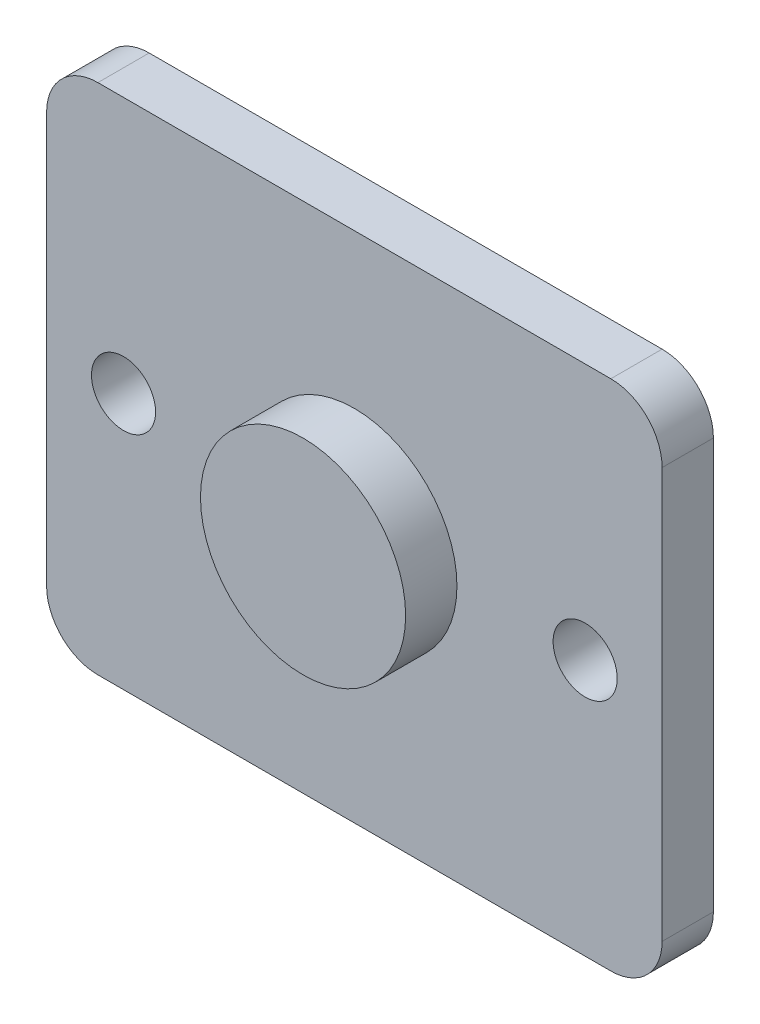
ISO-10303-21;
HEADER;
FILE_DESCRIPTION(('STEP AP214'),'2;1');
FILE_NAME('part.step','',(''),(''),'','','');
FILE_SCHEMA(('AUTOMOTIVE_DESIGN { 1 0 10303 214 1 1 1 1 }'));
ENDSEC;
DATA;
#1=APPLICATION_CONTEXT('core data for automotive mechanical design processes');
#2=APPLICATION_PROTOCOL_DEFINITION('international standard','automotive_design',2000,#1);
#3=PRODUCT_CONTEXT('',#1,'mechanical');
#4=PRODUCT('Part','Part','',(#3));
#5=PRODUCT_RELATED_PRODUCT_CATEGORY('part','',(#4));
#6=PRODUCT_DEFINITION_FORMATION('','',#4);
#7=PRODUCT_DEFINITION_CONTEXT('part definition',#1,'design');
#8=PRODUCT_DEFINITION('design','',#6,#7);
#9=PRODUCT_DEFINITION_SHAPE('','',#8);
#10=(LENGTH_UNIT() NAMED_UNIT(*) SI_UNIT(.MILLI.,.METRE.));
#11=(NAMED_UNIT(*) PLANE_ANGLE_UNIT() SI_UNIT($,.RADIAN.));
#12=(NAMED_UNIT(*) SI_UNIT($,.STERADIAN.) SOLID_ANGLE_UNIT());
#13=UNCERTAINTY_MEASURE_WITH_UNIT(LENGTH_MEASURE(1.E-05),#10,'distance_accuracy_value','');
#14=(GEOMETRIC_REPRESENTATION_CONTEXT(3) GLOBAL_UNCERTAINTY_ASSIGNED_CONTEXT((#13)) GLOBAL_UNIT_ASSIGNED_CONTEXT((#10,
#11,#12)) REPRESENTATION_CONTEXT('',''));
#15=CARTESIAN_POINT('',(0.,0.,0.));
#16=DIRECTION('',(0.,0.,1.));
#17=DIRECTION('',(1.,0.,0.));
#18=AXIS2_PLACEMENT_3D('',#15,#16,#17);
#19=CARTESIAN_POINT('',(-4.99999999994,-4.999999999969,1.));
#20=DIRECTION('',(0.,0.,-1.));
#21=DIRECTION('',(-1.,0.,0.));
#22=AXIS2_PLACEMENT_3D('',#19,#20,#21);
#23=PLANE('',#22);
#24=CARTESIAN_POINT('',(0.,0.,1.));
#25=DIRECTION('',(0.,0.,-1.));
#26=DIRECTION('',(0.,1.,0.));
#27=AXIS2_PLACEMENT_3D('',#24,#25,#26);
#28=CIRCLE('',#27,2.);
#29=CARTESIAN_POINT('',(0.,2.,1.));
#30=VERTEX_POINT('',#29);
#31=EDGE_CURVE('E140',#30,#30,#28,.F.);
#32=ORIENTED_EDGE('',*,*,#31,.F.);
#33=EDGE_LOOP('',(#32));
#34=FACE_BOUND('',#33,.T.);
#35=CARTESIAN_POINT('',(5.000000000026,4.000000000018,1.));
#36=DIRECTION('',(0.,0.,-1.));
#37=DIRECTION('',(0.,1.,0.));
#38=AXIS2_PLACEMENT_3D('',#35,#36,#37);
#39=CIRCLE('',#38,0.999999999974);
#40=CARTESIAN_POINT('',(5.000000000026,4.999999999992,1.));
#41=VERTEX_POINT('',#40);
#42=CARTESIAN_POINT('',(6.,4.000000000018,1.));
#43=VERTEX_POINT('',#42);
#44=EDGE_CURVE('E225',#41,#43,#39,.T.);
#45=ORIENTED_EDGE('',*,*,#44,.F.);
#46=DIRECTION('',(1.,0.,0.));
#47=VECTOR('',#46,1.);
#48=CARTESIAN_POINT('',(5.000000000019,4.999999999992,1.));
#49=LINE('',#48,#47);
#50=CARTESIAN_POINT('',(-4.999999999989,4.999999999992,1.));
#51=VERTEX_POINT('',#50);
#52=EDGE_CURVE('E162',#41,#51,#49,.F.);
#53=ORIENTED_EDGE('',*,*,#52,.T.);
#54=CARTESIAN_POINT('',(-4.999999999989,4.000000000018,1.));
#55=DIRECTION('',(0.,0.,-1.));
#56=DIRECTION('',(0.,1.,0.));
#57=AXIS2_PLACEMENT_3D('',#54,#55,#56);
#58=CIRCLE('',#57,0.999999999974);
#59=CARTESIAN_POINT('',(-5.9999999999815,4.0000000000215,1.));
#60=VERTEX_POINT('',#59);
#61=EDGE_CURVE('E233',#60,#51,#58,.T.);
#62=ORIENTED_EDGE('',*,*,#61,.F.);
#63=DIRECTION('',(0.,1.,0.));
#64=VECTOR('',#63,1.);
#65=CARTESIAN_POINT('',(-6.,4.00000000005,1.));
#66=LINE('',#65,#64);
#67=CARTESIAN_POINT('',(-6.,-3.999999999995,1.));
#68=VERTEX_POINT('',#67);
#69=EDGE_CURVE('E237',#60,#68,#66,.F.);
#70=ORIENTED_EDGE('',*,*,#69,.T.);
#71=CARTESIAN_POINT('',(-5.000000000026,-3.999999999995,1.));
#72=DIRECTION('',(0.,0.,-1.));
#73=DIRECTION('',(0.,1.,0.));
#74=AXIS2_PLACEMENT_3D('',#71,#72,#73);
#75=CIRCLE('',#74,0.999999999974);
#76=CARTESIAN_POINT('',(-5.0000000000045,-4.999999999969,1.));
#77=VERTEX_POINT('',#76);
#78=EDGE_CURVE('E241',#77,#68,#75,.T.);
#79=ORIENTED_EDGE('',*,*,#78,.F.);
#80=DIRECTION('',(1.,0.,0.));
#81=VECTOR('',#80,1.);
#82=CARTESIAN_POINT('',(-4.99999999994,-4.999999999969,1.));
#83=LINE('',#82,#81);
#84=CARTESIAN_POINT('',(5.000000000026,-4.999999999969,1.));
#85=VERTEX_POINT('',#84);
#86=EDGE_CURVE('E136',#77,#85,#83,.T.);
#87=ORIENTED_EDGE('',*,*,#86,.T.);
#88=CARTESIAN_POINT('',(5.000000000026,-4.000000000026,1.));
#89=DIRECTION('',(0.,0.,-1.));
#90=DIRECTION('',(0.,1.,0.));
#91=AXIS2_PLACEMENT_3D('',#88,#89,#90);
#92=CIRCLE('',#91,0.999999999974);
#93=CARTESIAN_POINT('',(6.,-4.000000000026,1.));
#94=VERTEX_POINT('',#93);
#95=EDGE_CURVE('E130',#94,#85,#92,.T.);
#96=ORIENTED_EDGE('',*,*,#95,.F.);
#97=DIRECTION('',(0.,1.,0.));
#98=VECTOR('',#97,1.);
#99=CARTESIAN_POINT('',(6.,-4.000000000026,1.));
#100=LINE('',#99,#98);
#101=EDGE_CURVE('E134',#94,#43,#100,.T.);
#102=ORIENTED_EDGE('',*,*,#101,.T.);
#103=EDGE_LOOP('',(#45,#53,#62,#70,#79,#87,#96,#102));
#104=FACE_BOUND('',#103,.T.);
#105=CARTESIAN_POINT('',(4.5,0.,1.));
#106=DIRECTION('',(0.,0.,1.));
#107=DIRECTION('',(1.,0.,0.));
#108=AXIS2_PLACEMENT_3D('',#105,#106,#107);
#109=CIRCLE('',#108,0.624999999999988);
#110=CARTESIAN_POINT('',(5.12499999999999,0.,1.));
#111=VERTEX_POINT('',#110);
#112=EDGE_CURVE('E172',#111,#111,#109,.T.);
#113=ORIENTED_EDGE('',*,*,#112,.F.);
#114=EDGE_LOOP('',(#113));
#115=FACE_BOUND('',#114,.T.);
#116=CARTESIAN_POINT('',(-4.5,0.,1.));
#117=DIRECTION('',(0.,0.,1.));
#118=DIRECTION('',(1.,0.,0.));
#119=AXIS2_PLACEMENT_3D('',#116,#117,#118);
#120=CIRCLE('',#119,0.624999999999988);
#121=CARTESIAN_POINT('',(-3.87500000000001,0.,1.));
#122=VERTEX_POINT('',#121);
#123=EDGE_CURVE('E289',#122,#122,#120,.T.);
#124=ORIENTED_EDGE('',*,*,#123,.F.);
#125=EDGE_LOOP('',(#124));
#126=FACE_BOUND('',#125,.T.);
#127=ADVANCED_FACE('F47',(#34,#104,#115,#126),#23,.F.);
#128=CARTESIAN_POINT('',(2.,0.,2.));
#129=DIRECTION('',(0.,0.,-1.));
#130=DIRECTION('',(0.,1.,0.));
#131=AXIS2_PLACEMENT_3D('',#128,#129,#130);
#132=PLANE('',#131);
#133=CARTESIAN_POINT('',(0.,0.,2.));
#134=DIRECTION('',(0.,0.,-1.));
#135=DIRECTION('',(0.,1.,0.));
#136=AXIS2_PLACEMENT_3D('',#133,#134,#135);
#137=CIRCLE('',#136,2.);
#138=CARTESIAN_POINT('',(0.,2.,2.));
#139=VERTEX_POINT('',#138);
#140=EDGE_CURVE('E52',#139,#139,#137,.T.);
#141=ORIENTED_EDGE('',*,*,#140,.F.);
#142=EDGE_LOOP('',(#141));
#143=FACE_BOUND('',#142,.T.);
#144=ADVANCED_FACE('F50',(#143),#132,.F.);
#145=CARTESIAN_POINT('',(0.,0.,1.));
#146=DIRECTION('',(0.,0.,-1.));
#147=DIRECTION('',(0.,1.,0.));
#148=AXIS2_PLACEMENT_3D('',#145,#146,#147);
#149=CYLINDRICAL_SURFACE('',#148,2.);
#150=ORIENTED_EDGE('',*,*,#140,.T.);
#151=EDGE_LOOP('',(#150));
#152=FACE_BOUND('',#151,.T.);
#153=ORIENTED_EDGE('',*,*,#31,.T.);
#154=EDGE_LOOP('',(#153));
#155=FACE_BOUND('',#154,.T.);
#156=ADVANCED_FACE('F306',(#152,#155),#149,.T.);
#157=CARTESIAN_POINT('',(5.000000000026,-4.000000000026,0.));
#158=DIRECTION('',(0.,0.,-1.));
#159=DIRECTION('',(0.,1.,0.));
#160=AXIS2_PLACEMENT_3D('',#157,#158,#159);
#161=CYLINDRICAL_SURFACE('',#160,0.999999999974);
#162=CARTESIAN_POINT('',(5.000000000026,-4.000000000026,0.));
#163=DIRECTION('',(0.,0.,-1.));
#164=DIRECTION('',(0.,1.,0.));
#165=AXIS2_PLACEMENT_3D('',#162,#163,#164);
#166=CIRCLE('',#165,0.999999999974);
#167=CARTESIAN_POINT('',(6.,-4.000000000026,0.));
#168=VERTEX_POINT('',#167);
#169=CARTESIAN_POINT('',(5.000000000026,-4.99999999997275,0.));
#170=VERTEX_POINT('',#169);
#171=EDGE_CURVE('E146',#168,#170,#166,.T.);
#172=ORIENTED_EDGE('',*,*,#171,.F.);
#173=DIRECTION('',(0.,0.,1.));
#174=VECTOR('',#173,1.);
#175=CARTESIAN_POINT('',(6.,-4.000000000026,0.));
#176=LINE('',#175,#174);
#177=EDGE_CURVE('E143',#168,#94,#176,.T.);
#178=ORIENTED_EDGE('',*,*,#177,.T.);
#179=ORIENTED_EDGE('',*,*,#95,.T.);
#180=DIRECTION('',(0.,0.,1.));
#181=VECTOR('',#180,1.);
#182=CARTESIAN_POINT('',(5.000000000026,-4.999999999969,0.));
#183=LINE('',#182,#181);
#184=EDGE_CURVE('E160',#85,#170,#183,.F.);
#185=ORIENTED_EDGE('',*,*,#184,.T.);
#186=EDGE_LOOP('',(#172,#178,#179,#185));
#187=FACE_BOUND('',#186,.T.);
#188=ADVANCED_FACE('F144',(#187),#161,.T.);
#189=CARTESIAN_POINT('',(-4.99999999994,-4.999999999969,0.));
#190=DIRECTION('',(0.,1.,0.));
#191=DIRECTION('',(0.,0.,1.));
#192=AXIS2_PLACEMENT_3D('',#189,#190,#191);
#193=PLANE('',#192);
#194=ORIENTED_EDGE('',*,*,#86,.F.);
#195=DIRECTION('',(0.,0.,-1.));
#196=VECTOR('',#195,1.);
#197=CARTESIAN_POINT('',(-4.999999999983,-4.999999999969,0.));
#198=LINE('',#197,#196);
#199=CARTESIAN_POINT('',(-5.0000000000045,-4.99999999997275,0.));
#200=VERTEX_POINT('',#199);
#201=EDGE_CURVE('E238',#200,#77,#198,.F.);
#202=ORIENTED_EDGE('',*,*,#201,.F.);
#203=DIRECTION('',(-1.,0.,0.));
#204=VECTOR('',#203,1.);
#205=CARTESIAN_POINT('',(-4.99999999994,-4.9999999999765,0.));
#206=LINE('',#205,#204);
#207=EDGE_CURVE('E194',#170,#200,#206,.T.);
#208=ORIENTED_EDGE('',*,*,#207,.F.);
#209=ORIENTED_EDGE('',*,*,#184,.F.);
#210=EDGE_LOOP('',(#194,#202,#208,#209));
#211=FACE_BOUND('',#210,.T.);
#212=ADVANCED_FACE('F345',(#211),#193,.F.);
#213=CARTESIAN_POINT('',(-5.000000000026,-3.999999999995,0.));
#214=DIRECTION('',(0.,0.,-1.));
#215=DIRECTION('',(0.,1.,0.));
#216=AXIS2_PLACEMENT_3D('',#213,#214,#215);
#217=CYLINDRICAL_SURFACE('',#216,0.999999999974);
#218=CARTESIAN_POINT('',(-5.000000000026,-3.999999999995,0.));
#219=DIRECTION('',(0.,0.,-1.));
#220=DIRECTION('',(0.,1.,0.));
#221=AXIS2_PLACEMENT_3D('',#218,#219,#220);
#222=CIRCLE('',#221,0.999999999974);
#223=CARTESIAN_POINT('',(-6.,-3.999999999995,0.));
#224=VERTEX_POINT('',#223);
#225=EDGE_CURVE('E193',#200,#224,#222,.T.);
#226=ORIENTED_EDGE('',*,*,#225,.F.);
#227=ORIENTED_EDGE('',*,*,#201,.T.);
#228=ORIENTED_EDGE('',*,*,#78,.T.);
#229=DIRECTION('',(0.,0.,-1.));
#230=VECTOR('',#229,1.);
#231=CARTESIAN_POINT('',(-6.,-3.999999999995,0.));
#232=LINE('',#231,#230);
#233=EDGE_CURVE('E234',#68,#224,#232,.T.);
#234=ORIENTED_EDGE('',*,*,#233,.T.);
#235=EDGE_LOOP('',(#226,#227,#228,#234));
#236=FACE_BOUND('',#235,.T.);
#237=ADVANCED_FACE('F279',(#236),#217,.T.);
#238=CARTESIAN_POINT('',(-6.,4.00000000005,0.));
#239=DIRECTION('',(1.,0.,0.));
#240=DIRECTION('',(0.,0.,-1.));
#241=AXIS2_PLACEMENT_3D('',#238,#239,#240);
#242=PLANE('',#241);
#243=ORIENTED_EDGE('',*,*,#69,.F.);
#244=DIRECTION('',(0.,0.,-1.));
#245=VECTOR('',#244,1.);
#246=CARTESIAN_POINT('',(-5.999999999963,4.000000000025,0.));
#247=LINE('',#246,#245);
#248=CARTESIAN_POINT('',(-5.9999999999815,4.0000000000215,0.));
#249=VERTEX_POINT('',#248);
#250=EDGE_CURVE('E230',#249,#60,#247,.F.);
#251=ORIENTED_EDGE('',*,*,#250,.F.);
#252=DIRECTION('',(0.,1.,0.));
#253=VECTOR('',#252,1.);
#254=CARTESIAN_POINT('',(-6.,-4.999999999969,0.));
#255=LINE('',#254,#253);
#256=EDGE_CURVE('E188',#224,#249,#255,.T.);
#257=ORIENTED_EDGE('',*,*,#256,.F.);
#258=ORIENTED_EDGE('',*,*,#233,.F.);
#259=EDGE_LOOP('',(#243,#251,#257,#258));
#260=FACE_BOUND('',#259,.T.);
#261=ADVANCED_FACE('F277',(#260),#242,.F.);
#262=CARTESIAN_POINT('',(-4.999999999989,4.000000000018,0.));
#263=DIRECTION('',(0.,0.,-1.));
#264=DIRECTION('',(0.,1.,0.));
#265=AXIS2_PLACEMENT_3D('',#262,#263,#264);
#266=CYLINDRICAL_SURFACE('',#265,0.999999999974);
#267=CARTESIAN_POINT('',(-4.999999999989,4.000000000018,0.));
#268=DIRECTION('',(0.,0.,-1.));
#269=DIRECTION('',(0.,1.,0.));
#270=AXIS2_PLACEMENT_3D('',#267,#268,#269);
#271=CIRCLE('',#270,0.999999999974);
#272=CARTESIAN_POINT('',(-4.999999999989,4.999999999992,0.));
#273=VERTEX_POINT('',#272);
#274=EDGE_CURVE('E187',#249,#273,#271,.T.);
#275=ORIENTED_EDGE('',*,*,#274,.F.);
#276=ORIENTED_EDGE('',*,*,#250,.T.);
#277=ORIENTED_EDGE('',*,*,#61,.T.);
#278=DIRECTION('',(0.,0.,-1.));
#279=VECTOR('',#278,1.);
#280=CARTESIAN_POINT('',(-4.999999999989,4.999999999992,0.));
#281=LINE('',#280,#279);
#282=EDGE_CURVE('E226',#51,#273,#281,.T.);
#283=ORIENTED_EDGE('',*,*,#282,.T.);
#284=EDGE_LOOP('',(#275,#276,#277,#283));
#285=FACE_BOUND('',#284,.T.);
#286=ADVANCED_FACE('F274',(#285),#266,.T.);
#287=CARTESIAN_POINT('',(5.000000000019,4.999999999992,0.));
#288=DIRECTION('',(0.,-1.,0.));
#289=DIRECTION('',(0.,0.,-1.));
#290=AXIS2_PLACEMENT_3D('',#287,#288,#289);
#291=PLANE('',#290);
#292=ORIENTED_EDGE('',*,*,#52,.F.);
#293=DIRECTION('',(0.,0.,-1.));
#294=VECTOR('',#293,1.);
#295=CARTESIAN_POINT('',(5.000000000026,4.999999999992,0.));
#296=LINE('',#295,#294);
#297=CARTESIAN_POINT('',(5.000000000026,4.999999999992,0.));
#298=VERTEX_POINT('',#297);
#299=EDGE_CURVE('E149',#298,#41,#296,.F.);
#300=ORIENTED_EDGE('',*,*,#299,.F.);
#301=DIRECTION('',(-1.,0.,0.));
#302=VECTOR('',#301,1.);
#303=CARTESIAN_POINT('',(-4.99999999994,4.999999999992,0.));
#304=LINE('',#303,#302);
#305=EDGE_CURVE('E183',#273,#298,#304,.F.);
#306=ORIENTED_EDGE('',*,*,#305,.F.);
#307=ORIENTED_EDGE('',*,*,#282,.F.);
#308=EDGE_LOOP('',(#292,#300,#306,#307));
#309=FACE_BOUND('',#308,.T.);
#310=ADVANCED_FACE('F269',(#309),#291,.F.);
#311=CARTESIAN_POINT('',(5.000000000026,4.000000000018,0.));
#312=DIRECTION('',(0.,0.,-1.));
#313=DIRECTION('',(0.,1.,0.));
#314=AXIS2_PLACEMENT_3D('',#311,#312,#313);
#315=CYLINDRICAL_SURFACE('',#314,0.999999999974);
#316=CARTESIAN_POINT('',(5.000000000026,4.000000000018,0.));
#317=DIRECTION('',(0.,0.,-1.));
#318=DIRECTION('',(0.,1.,0.));
#319=AXIS2_PLACEMENT_3D('',#316,#317,#318);
#320=CIRCLE('',#319,0.999999999974);
#321=CARTESIAN_POINT('',(6.,4.000000000018,0.));
#322=VERTEX_POINT('',#321);
#323=EDGE_CURVE('E60',#298,#322,#320,.T.);
#324=ORIENTED_EDGE('',*,*,#323,.F.);
#325=ORIENTED_EDGE('',*,*,#299,.T.);
#326=ORIENTED_EDGE('',*,*,#44,.T.);
#327=DIRECTION('',(0.,0.,1.));
#328=VECTOR('',#327,1.);
#329=CARTESIAN_POINT('',(6.,4.000000000018,0.));
#330=LINE('',#329,#328);
#331=EDGE_CURVE('E71',#43,#322,#330,.F.);
#332=ORIENTED_EDGE('',*,*,#331,.T.);
#333=EDGE_LOOP('',(#324,#325,#326,#332));
#334=FACE_BOUND('',#333,.T.);
#335=ADVANCED_FACE('F264',(#334),#315,.T.);
#336=CARTESIAN_POINT('',(6.,-4.000000000026,0.));
#337=DIRECTION('',(-1.,0.,0.));
#338=DIRECTION('',(0.,0.,1.));
#339=AXIS2_PLACEMENT_3D('',#336,#337,#338);
#340=PLANE('',#339);
#341=ORIENTED_EDGE('',*,*,#101,.F.);
#342=ORIENTED_EDGE('',*,*,#177,.F.);
#343=DIRECTION('',(0.,1.,0.));
#344=VECTOR('',#343,1.);
#345=CARTESIAN_POINT('',(6.,-4.999999999969,0.));
#346=LINE('',#345,#344);
#347=EDGE_CURVE('E12',#322,#168,#346,.F.);
#348=ORIENTED_EDGE('',*,*,#347,.F.);
#349=ORIENTED_EDGE('',*,*,#331,.F.);
#350=EDGE_LOOP('',(#341,#342,#348,#349));
#351=FACE_BOUND('',#350,.T.);
#352=ADVANCED_FACE('F151',(#351),#340,.F.);
#353=CARTESIAN_POINT('',(-4.99999999994,-4.999999999969,0.));
#354=DIRECTION('',(0.,0.,-1.));
#355=DIRECTION('',(-1.,0.,0.));
#356=AXIS2_PLACEMENT_3D('',#353,#354,#355);
#357=PLANE('',#356);
#358=CARTESIAN_POINT('',(-4.5,0.,0.));
#359=DIRECTION('',(0.,0.,-1.));
#360=DIRECTION('',(-1.,0.,0.));
#361=AXIS2_PLACEMENT_3D('',#358,#359,#360);
#362=CIRCLE('',#361,0.624999999999994);
#363=CARTESIAN_POINT('',(-5.12499999999999,0.,0.));
#364=VERTEX_POINT('',#363);
#365=EDGE_CURVE('E177',#364,#364,#362,.T.);
#366=ORIENTED_EDGE('',*,*,#365,.F.);
#367=EDGE_LOOP('',(#366));
#368=FACE_BOUND('',#367,.T.);
#369=CARTESIAN_POINT('',(4.5,0.,0.));
#370=DIRECTION('',(0.,0.,-1.));
#371=DIRECTION('',(-1.,0.,0.));
#372=AXIS2_PLACEMENT_3D('',#369,#370,#371);
#373=CIRCLE('',#372,0.624999999999994);
#374=CARTESIAN_POINT('',(3.87500000000001,0.,0.));
#375=VERTEX_POINT('',#374);
#376=EDGE_CURVE('E176',#375,#375,#373,.T.);
#377=ORIENTED_EDGE('',*,*,#376,.F.);
#378=EDGE_LOOP('',(#377));
#379=FACE_BOUND('',#378,.T.);
#380=ORIENTED_EDGE('',*,*,#323,.T.);
#381=ORIENTED_EDGE('',*,*,#347,.T.);
#382=ORIENTED_EDGE('',*,*,#171,.T.);
#383=ORIENTED_EDGE('',*,*,#207,.T.);
#384=ORIENTED_EDGE('',*,*,#225,.T.);
#385=ORIENTED_EDGE('',*,*,#256,.T.);
#386=ORIENTED_EDGE('',*,*,#274,.T.);
#387=ORIENTED_EDGE('',*,*,#305,.T.);
#388=EDGE_LOOP('',(#380,#381,#382,#383,#384,#385,#386,#387));
#389=FACE_BOUND('',#388,.T.);
#390=ADVANCED_FACE('F284',(#368,#379,#389),#357,.T.);
#391=CARTESIAN_POINT('',(4.5,0.,1.));
#392=DIRECTION('',(0.,0.,1.));
#393=DIRECTION('',(1.,0.,0.));
#394=AXIS2_PLACEMENT_3D('',#391,#392,#393);
#395=CYLINDRICAL_SURFACE('',#394,0.624999999999994);
#396=ORIENTED_EDGE('',*,*,#112,.T.);
#397=EDGE_LOOP('',(#396));
#398=FACE_BOUND('',#397,.T.);
#399=ORIENTED_EDGE('',*,*,#376,.T.);
#400=EDGE_LOOP('',(#399));
#401=FACE_BOUND('',#400,.T.);
#402=ADVANCED_FACE('F308',(#398,#401),#395,.F.);
#403=CARTESIAN_POINT('',(-4.5,0.,1.));
#404=DIRECTION('',(0.,0.,1.));
#405=DIRECTION('',(1.,0.,0.));
#406=AXIS2_PLACEMENT_3D('',#403,#404,#405);
#407=CYLINDRICAL_SURFACE('',#406,0.624999999999994);
#408=ORIENTED_EDGE('',*,*,#123,.T.);
#409=EDGE_LOOP('',(#408));
#410=FACE_BOUND('',#409,.T.);
#411=ORIENTED_EDGE('',*,*,#365,.T.);
#412=EDGE_LOOP('',(#411));
#413=FACE_BOUND('',#412,.T.);
#414=ADVANCED_FACE('F298',(#410,#413),#407,.F.);
#415=CLOSED_SHELL('',(#127,#144,#156,#188,#212,#237,#261,#286,#310,#335,#352,#390,#402,#414));
#416=MANIFOLD_SOLID_BREP('B2',#415);
#417=ADVANCED_BREP_SHAPE_REPRESENTATION('',(#18,#416),#14);
#418=SHAPE_DEFINITION_REPRESENTATION(#9,#417);
ENDSEC;
END-ISO-10303-21;
